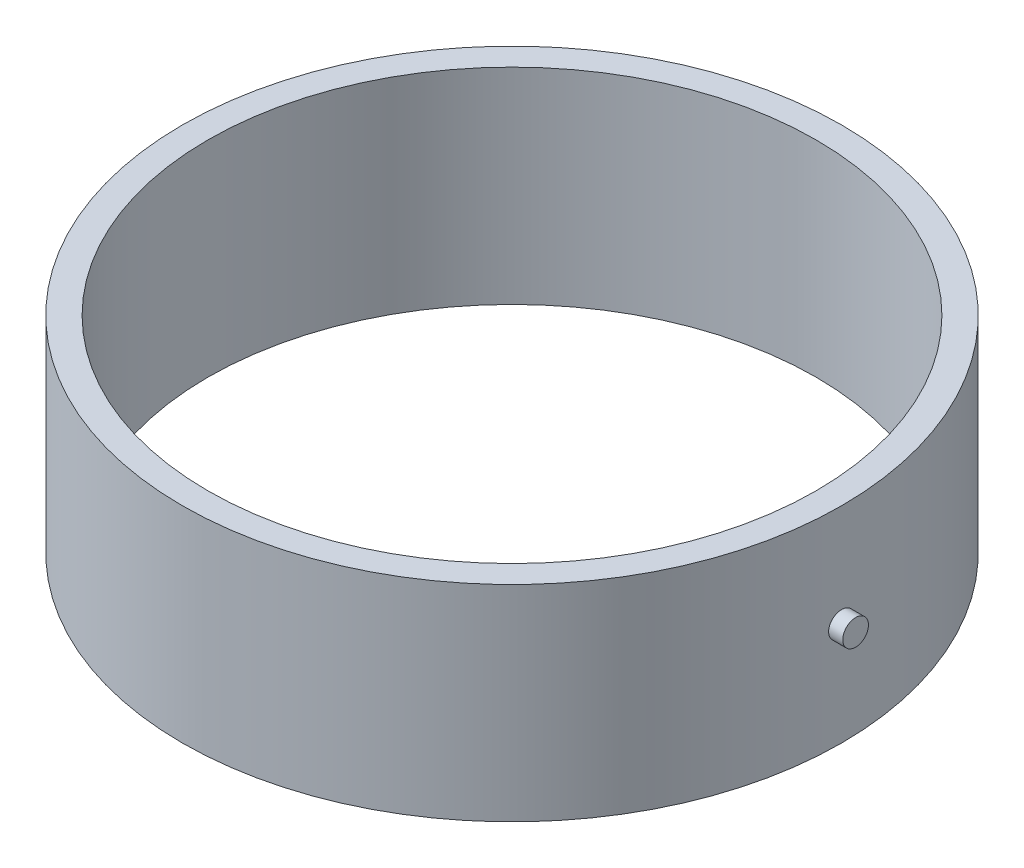
ISO-10303-21;
HEADER;
FILE_DESCRIPTION(('STEP AP214'),'2;1');
FILE_NAME('part.step','',(''),(''),'','','');
FILE_SCHEMA(('AUTOMOTIVE_DESIGN { 1 0 10303 214 1 1 1 1 }'));
ENDSEC;
DATA;
#1=APPLICATION_CONTEXT('core data for automotive mechanical design processes');
#2=APPLICATION_PROTOCOL_DEFINITION('international standard','automotive_design',2000,#1);
#3=PRODUCT_CONTEXT('',#1,'mechanical');
#4=PRODUCT('Part','Part','',(#3));
#5=PRODUCT_RELATED_PRODUCT_CATEGORY('part','',(#4));
#6=PRODUCT_DEFINITION_FORMATION('','',#4);
#7=PRODUCT_DEFINITION_CONTEXT('part definition',#1,'design');
#8=PRODUCT_DEFINITION('design','',#6,#7);
#9=PRODUCT_DEFINITION_SHAPE('','',#8);
#10=(LENGTH_UNIT() NAMED_UNIT(*) SI_UNIT(.MILLI.,.METRE.));
#11=(NAMED_UNIT(*) PLANE_ANGLE_UNIT() SI_UNIT($,.RADIAN.));
#12=(NAMED_UNIT(*) SI_UNIT($,.STERADIAN.) SOLID_ANGLE_UNIT());
#13=UNCERTAINTY_MEASURE_WITH_UNIT(LENGTH_MEASURE(1.E-05),#10,'distance_accuracy_value','');
#14=(GEOMETRIC_REPRESENTATION_CONTEXT(3) GLOBAL_UNCERTAINTY_ASSIGNED_CONTEXT((#13)) GLOBAL_UNIT_ASSIGNED_CONTEXT((#10,
#11,#12)) REPRESENTATION_CONTEXT('',''));
#15=CARTESIAN_POINT('',(0.,0.,0.));
#16=DIRECTION('',(0.,0.,1.));
#17=DIRECTION('',(1.,0.,0.));
#18=AXIS2_PLACEMENT_3D('',#15,#16,#17);
#19=CARTESIAN_POINT('',(0.,609.6,0.));
#20=DIRECTION('',(0.,-1.,0.));
#21=DIRECTION('',(0.,0.,-1.));
#22=AXIS2_PLACEMENT_3D('',#19,#20,#21);
#23=CYLINDRICAL_SURFACE('',#22,1955.8);
#24=CARTESIAN_POINT('',(-1954.31502066581,0.,76.2));
#25=CARTESIAN_POINT('',(-1954.31502054432,-1.0699032694373,76.2000012320065));
#26=CARTESIAN_POINT('',(-1954.31589970974,-2.13977115448662,76.1774645107551));
#27=CARTESIAN_POINT('',(-1954.31940995016,-4.27769876096838,76.0873576901653));
#28=CARTESIAN_POINT('',(-1954.3220411459,-5.34575835270913,76.0197844874354));
#29=CARTESIAN_POINT('',(-1954.32903762328,-7.47826453966097,75.8397046362414));
#30=CARTESIAN_POINT('',(-1954.33340321512,-8.54271045419157,75.7271899498636));
#31=CARTESIAN_POINT('',(-1954.34383786565,-10.6660100346889,75.4574159370714));
#32=CARTESIAN_POINT('',(-1954.34990708198,-11.7248631739323,75.3001524701712));
#33=CARTESIAN_POINT('',(-1954.36371255116,-13.8360504787401,74.9409860185726));
#34=CARTESIAN_POINT('',(-1954.3714504661,-14.888377060671,74.7390385218219));
#35=CARTESIAN_POINT('',(-1954.38853539624,-16.9836652100604,74.2909347100842));
#36=CARTESIAN_POINT('',(-1954.39788256222,-18.0266258903724,74.044774252631));
#37=CARTESIAN_POINT('',(-1954.4181172593,-20.1010603850933,73.5087399017551));
#38=CARTESIAN_POINT('',(-1954.42900454498,-21.1325360015167,73.2188729727253));
#39=CARTESIAN_POINT('',(-1954.45224412721,-23.1824301059313,72.5958854672413));
#40=CARTESIAN_POINT('',(-1954.46459656076,-24.2008473629953,72.2627608456219));
#41=CARTESIAN_POINT('',(-1954.49067023253,-26.2221413559985,71.554074778774));
#42=CARTESIAN_POINT('',(-1954.50439069045,-27.2250265782924,71.1785375091333));
#43=CARTESIAN_POINT('',(-1954.53310997513,-29.2141584777919,70.3855059136794));
#44=CARTESIAN_POINT('',(-1954.54810892134,-30.2004035900825,69.9680076670604));
#45=CARTESIAN_POINT('',(-1954.5792762048,-32.154332741523,69.0918602209303));
#46=CARTESIAN_POINT('',(-1954.5954444507,-33.1220182231673,68.6332142353701));
#47=CARTESIAN_POINT('',(-1954.62883782414,-35.0372740796784,67.675519427572));
#48=CARTESIAN_POINT('',(-1954.64606305033,-35.9848425655331,67.176466832096));
#49=CARTESIAN_POINT('',(-1954.68144103616,-37.8577887843304,66.1390453769815));
#50=CARTESIAN_POINT('',(-1954.69959347702,-38.7831739850955,65.6006900023939));
#51=CARTESIAN_POINT('',(-1954.73670211095,-40.6104609022474,64.4854765929411));
#52=CARTESIAN_POINT('',(-1954.75565837893,-41.512360417266,63.9086149667241));
#53=CARTESIAN_POINT('',(-1954.81352905433,-44.180220942541,62.1218729120242));
#54=CARTESIAN_POINT('',(-1954.8534550982,-45.9088550639474,60.8555521149227));
#55=CARTESIAN_POINT('',(-1954.93487519688,-49.2540984169572,58.1813005329998));
#56=CARTESIAN_POINT('',(-1954.97637014879,-50.8706420101007,56.7732879389729));
#57=CARTESIAN_POINT('',(-1955.05973486447,-53.9794533986344,53.8260678131164));
#58=CARTESIAN_POINT('',(-1955.10160462873,-55.4717210323285,52.2868601105935));
#59=CARTESIAN_POINT('',(-1955.18453135335,-58.3213598370288,49.0881602163539));
#60=CARTESIAN_POINT('',(-1955.22558828126,-59.678725633444,47.428663236773));
#61=CARTESIAN_POINT('',(-1955.30572346837,-62.2488765502836,44.0011996403346));
#62=CARTESIAN_POINT('',(-1955.34480172779,-63.46166168664,42.2332330354298));
#63=CARTESIAN_POINT('',(-1955.41988230111,-65.7343670766078,38.6008325077283));
#64=CARTESIAN_POINT('',(-1955.45588368686,-66.7942412701175,36.736369747026));
#65=CARTESIAN_POINT('',(-1955.52377546286,-68.7531463213757,32.9247077433595));
#66=CARTESIAN_POINT('',(-1955.55566585189,-69.6521771312604,30.9775084757747));
#67=CARTESIAN_POINT('',(-1955.61443005306,-71.2829820645064,27.0142228526142));
#68=CARTESIAN_POINT('',(-1955.64130388829,-72.014756957863,24.9981368142213));
#69=CARTESIAN_POINT('',(-1955.68927196711,-73.3058321590293,20.9114088023428));
#70=CARTESIAN_POINT('',(-1955.71036621381,-73.8651325598015,18.840766858263));
#71=CARTESIAN_POINT('',(-1955.74616675994,-74.8070213317288,14.6607354730608));
#72=CARTESIAN_POINT('',(-1955.76087632638,-75.1897000858249,12.5513664257603));
#73=CARTESIAN_POINT('',(-1955.78350573602,-75.7760339198753,8.30785590202983));
#74=CARTESIAN_POINT('',(-1955.7914255813,-75.9796890547327,6.17371443319731));
#75=CARTESIAN_POINT('',(-1955.80025070605,-76.2065192572113,1.89585802348664));
#76=CARTESIAN_POINT('',(-1955.80115602103,-76.2296952382835,-0.247856868883022));
#77=CARTESIAN_POINT('',(-1955.79592647495,-76.0954037803411,-4.52961201811098));
#78=CARTESIAN_POINT('',(-1955.78979161593,-75.9379363933528,-6.66765227660341));
#79=CARTESIAN_POINT('',(-1955.77066110102,-75.4436188218371,-10.921683753478));
#80=CARTESIAN_POINT('',(-1955.75766917677,-75.1068662039807,-13.0376863267659));
#81=CARTESIAN_POINT('',(-1955.72519517142,-74.2564428430637,-17.233783913662));
#82=CARTESIAN_POINT('',(-1955.70571309303,-73.742772174244,-19.313878942338));
#83=CARTESIAN_POINT('',(-1955.66081098927,-72.542174793995,-23.4233915659623));
#84=CARTESIAN_POINT('',(-1955.63539094976,-71.8552476705244,-25.4528090403759));
#85=CARTESIAN_POINT('',(-1955.57933336262,-70.3130317661298,-29.4465563659876));
#86=CARTESIAN_POINT('',(-1955.54869581283,-69.457742915858,-31.410886190376));
#87=CARTESIAN_POINT('',(-1955.48306227159,-67.5846328103103,-35.2610513521314));
#88=CARTESIAN_POINT('',(-1955.44806508816,-66.5667670828715,-37.1468650333096));
#89=CARTESIAN_POINT('',(-1955.37471080097,-64.3759089748255,-40.8260506929157));
#90=CARTESIAN_POINT('',(-1955.33635369681,-63.2029165756867,-42.6194226603001));
#91=CARTESIAN_POINT('',(-1955.25736640094,-60.7101322074961,-46.101016592764));
#92=CARTESIAN_POINT('',(-1955.21673620141,-59.3903397337004,-47.7892381962729));
#93=CARTESIAN_POINT('',(-1955.13435415897,-56.6133234952139,-51.0485588121218));
#94=CARTESIAN_POINT('',(-1955.09260231553,-55.1560996662264,-52.6196577696658));
#95=CARTESIAN_POINT('',(-1955.00913240691,-52.1135413303658,-55.6345990634161));
#96=CARTESIAN_POINT('',(-1954.96741438268,-50.528122231374,-57.0783560351707));
#97=CARTESIAN_POINT('',(-1954.88522401448,-47.2412696108866,-59.82718711311));
#98=CARTESIAN_POINT('',(-1954.8447516711,-45.5398360343915,-61.1322611535478));
#99=CARTESIAN_POINT('',(-1954.76620171989,-42.0330300532422,-63.5944526057643));
#100=CARTESIAN_POINT('',(-1954.72812411322,-40.2276575976851,-64.7515699450821));
#101=CARTESIAN_POINT('',(-1954.65544520409,-36.5257921495716,-66.9096162560734));
#102=CARTESIAN_POINT('',(-1954.62084390091,-34.6292991757558,-67.91054525987));
#103=CARTESIAN_POINT('',(-1954.55610027013,-30.7586266087664,-69.7491044621866));
#104=CARTESIAN_POINT('',(-1954.52595802602,-28.7844455617731,-70.5867316030009));
#105=CARTESIAN_POINT('',(-1954.47099034108,-24.772461959051,-72.0926910787785));
#106=CARTESIAN_POINT('',(-1954.44616490071,-22.7346593976963,-72.7610233987714));
#107=CARTESIAN_POINT('',(-1954.40253714658,-18.609935131559,-73.9236196393174));
#108=CARTESIAN_POINT('',(-1954.38373481022,-16.5230136110146,-74.4178842126629));
#109=CARTESIAN_POINT('',(-1954.35268827495,-12.3148981126607,-75.228815875971));
#110=CARTESIAN_POINT('',(-1954.34044407236,-10.1937041540854,-75.5454830656004));
#111=CARTESIAN_POINT('',(-1954.32286815757,-5.93355148425512,-75.9988062611718));
#112=CARTESIAN_POINT('',(-1954.31753190301,-3.79460537837479,-76.1355805578553));
#113=CARTESIAN_POINT('',(-1954.3139087481,0.487212713343914,-76.2285266123024));
#114=CARTESIAN_POINT('',(-1954.31562184469,2.63008469747054,-76.1846984487931));
#115=CARTESIAN_POINT('',(-1954.32604866065,6.90450552732663,-75.916753185454));
#116=CARTESIAN_POINT('',(-1954.33476236658,9.03605439477528,-75.6926364315666));
#117=CARTESIAN_POINT('',(-1954.35894260138,13.2726716120021,-75.0657157216542));
#118=CARTESIAN_POINT('',(-1954.37440912998,15.3777399628199,-74.6629117726446));
#119=CARTESIAN_POINT('',(-1954.41164958116,19.5457875620117,-73.6816439941656));
#120=CARTESIAN_POINT('',(-1954.43342156338,21.6087795497503,-73.1032342010049));
#121=CARTESIAN_POINT('',(-1954.48265643674,25.6786907545053,-71.7748357482602));
#122=CARTESIAN_POINT('',(-1954.51011932628,27.6856099872114,-71.0248471366858));
#123=CARTESIAN_POINT('',(-1954.56995653402,31.6291393419855,-69.3586294979046));
#124=CARTESIAN_POINT('',(-1954.6023308654,33.5657492752903,-68.4424000244219));
#125=CARTESIAN_POINT('',(-1954.67107240572,37.3549213570271,-66.4502182949745));
#126=CARTESIAN_POINT('',(-1954.70743961683,39.2074834599797,-65.3742659525834));
#127=CARTESIAN_POINT('',(-1954.78315546639,42.816373103932,-63.0696788468229));
#128=CARTESIAN_POINT('',(-1954.82250565391,44.5726498166543,-61.8409645389434));
#129=CARTESIAN_POINT('',(-1954.90305427102,47.975467021318,-59.2400251735009));
#130=CARTESIAN_POINT('',(-1954.94425270119,49.6220074789464,-57.8678000710645));
#131=CARTESIAN_POINT('',(-1955.0273294646,52.7936814025179,-54.9895730639468));
#132=CARTESIAN_POINT('',(-1955.0692078003,54.3188144294018,-53.4835706755136));
#133=CARTESIAN_POINT('',(-1955.1524567758,57.2368493455637,-50.3484758213501));
#134=CARTESIAN_POINT('',(-1955.19382741545,58.6297511979976,-48.719383321323));
#135=CARTESIAN_POINT('',(-1955.27490989068,61.2741496969038,-45.3487544911348));
#136=CARTESIAN_POINT('',(-1955.31462082267,62.5255699341463,-43.6071581918977));
#137=CARTESIAN_POINT('',(-1955.39123322572,64.8772435681247,-40.0246725408177));
#138=CARTESIAN_POINT('',(-1955.42813469561,65.9774969018798,-38.1837831476068));
#139=CARTESIAN_POINT('',(-1955.49808065139,68.0190026128655,-34.4157906651572));
#140=CARTESIAN_POINT('',(-1955.53112514677,68.9602553812383,-32.4886877880189));
#141=CARTESIAN_POINT('',(-1955.59241912126,70.6770552765632,-28.5619589919838));
#142=CARTESIAN_POINT('',(-1955.62066860239,71.4526024733801,-26.5623331036645));
#143=CARTESIAN_POINT('',(-1955.67156307313,72.8322600905218,-22.5053592742518));
#144=CARTESIAN_POINT('',(-1955.6942096677,73.4364196127787,-20.448028051514));
#145=CARTESIAN_POINT('',(-1955.7332660028,74.4692849090589,-16.2897259612025));
#146=CARTESIAN_POINT('',(-1955.74967574413,74.8979907055496,-14.1887550992171));
#147=CARTESIAN_POINT('',(-1955.77579240652,75.5768842418886,-9.95812895551899));
#148=CARTESIAN_POINT('',(-1955.78549934118,75.8270723439001,-7.82847373200798));
#149=CARTESIAN_POINT('',(-1955.79793477156,76.1471426572066,-3.55563689629363));
#150=CARTESIAN_POINT('',(-1955.80066327051,76.2170249518799,-1.41245529034571));
#151=CARTESIAN_POINT('',(-1955.79906489457,76.17599779238,2.87074911662647));
#152=CARTESIAN_POINT('',(-1955.79474270427,76.0652083793638,5.01077307022236));
#153=CARTESIAN_POINT('',(-1955.7791744011,75.6638560052605,9.27386976628419));
#154=CARTESIAN_POINT('',(-1955.76792829149,75.3732931291312,11.3969425167605));
#155=CARTESIAN_POINT('',(-1955.73883106382,74.6144679764119,15.6110473852403));
#156=CARTESIAN_POINT('',(-1955.72097993482,74.1462054059033,17.702079450242));
#157=CARTESIAN_POINT('',(-1955.67917884861,73.0353224129719,21.8372410914878));
#158=CARTESIAN_POINT('',(-1955.65522889019,72.3927019560606,23.8813706584544));
#159=CARTESIAN_POINT('',(-1955.60190869867,70.9376728421058,27.9082389193096));
#160=CARTESIAN_POINT('',(-1955.57253839403,70.1252619440624,29.890976802516));
#161=CARTESIAN_POINT('',(-1955.50921026183,68.3364463689405,33.7809583890966));
#162=CARTESIAN_POINT('',(-1955.47525243374,67.3600416731581,35.6882020838606));
#163=CARTESIAN_POINT('',(-1955.40371217656,65.2501985858577,39.4136233165284));
#164=CARTESIAN_POINT('',(-1955.36612987265,64.1167656173035,41.2318039272878));
#165=CARTESIAN_POINT('',(-1955.28840626089,61.7009635857211,44.7662135975));
#166=CARTESIAN_POINT('',(-1955.24826495417,60.4185945887138,46.4824427021456));
#167=CARTESIAN_POINT('',(-1955.16653049286,57.7129949623699,49.8019669893461));
#168=CARTESIAN_POINT('',(-1955.12493654472,56.2896865356026,51.4051989532161));
#169=CARTESIAN_POINT('',(-1955.06237156751,54.0576581905139,53.7155266317457));
#170=CARTESIAN_POINT('',(-1955.04148470221,53.2973606853452,54.4699790347981));
#171=CARTESIAN_POINT('',(-1954.99979861225,51.7456648965777,55.946155550188));
#172=CARTESIAN_POINT('',(-1954.97899937957,50.9542695263506,56.6678827147759));
#173=CARTESIAN_POINT('',(-1954.93762890484,49.3414937600209,58.0775741323293));
#174=CARTESIAN_POINT('',(-1954.91705774437,48.5201030578983,58.765526586728));
#175=CARTESIAN_POINT('',(-1954.87629843484,46.8491164160661,60.1061352042408));
#176=CARTESIAN_POINT('',(-1954.85611025015,45.9995231200598,60.7587946607165));
#177=CARTESIAN_POINT('',(-1954.81625700501,44.2735031860127,62.027771060264));
#178=CARTESIAN_POINT('',(-1954.79659198548,43.3970744607426,62.6440851654713));
#179=CARTESIAN_POINT('',(-1954.75792833329,41.6190848558335,63.8391653267163));
#180=CARTESIAN_POINT('',(-1954.73892963849,40.7175263337825,64.4179348882117));
#181=CARTESIAN_POINT('',(-1954.70171623132,38.8900334801985,65.5374282995815));
#182=CARTESIAN_POINT('',(-1954.68350218956,37.9640793464553,66.0781198463853));
#183=CARTESIAN_POINT('',(-1954.64800647231,36.0902562220107,67.1199108579878));
#184=CARTESIAN_POINT('',(-1954.63072470973,35.1423892903107,67.6210140232578));
#185=CARTESIAN_POINT('',(-1954.59721218772,33.2261898928189,68.5828676413603));
#186=CARTESIAN_POINT('',(-1954.58098159659,32.257854182804,69.0436116369806));
#187=CARTESIAN_POINT('',(-1954.54969162562,30.3026791167983,69.9237934380201));
#188=CARTESIAN_POINT('',(-1954.53463213605,29.3158415054162,70.3432351148922));
#189=CARTESIAN_POINT('',(-1954.50580454122,27.3263298784361,71.139712345523));
#190=CARTESIAN_POINT('',(-1954.49203515497,26.3236727521996,71.5167900402438));
#191=CARTESIAN_POINT('',(-1954.465869955,24.3034338382651,72.2283179749008));
#192=CARTESIAN_POINT('',(-1954.45347401415,23.2858534419148,72.5627721609522));
#193=CARTESIAN_POINT('',(-1954.43014456181,21.2376636157871,73.1884419981795));
#194=CARTESIAN_POINT('',(-1954.41921078804,20.2070565592426,73.4796654054803));
#195=CARTESIAN_POINT('',(-1954.39888163629,18.1345613476783,74.0184035183988));
#196=CARTESIAN_POINT('',(-1954.38948615207,17.0926739770877,74.265921242837));
#197=CARTESIAN_POINT('',(-1954.37007890776,14.7288650858167,74.7751002577515));
#198=CARTESIAN_POINT('',(-1954.36053517944,13.4041462258531,75.0238910737182));
#199=CARTESIAN_POINT('',(-1954.34409906406,10.7436850764795,75.4508318648255));
#200=CARTESIAN_POINT('',(-1954.33720609297,9.40794528151912,75.6289974003793));
#201=CARTESIAN_POINT('',(-1954.32614566911,6.72888860871243,75.9142723017064));
#202=CARTESIAN_POINT('',(-1954.32197821531,5.38557173367861,76.0213816938524));
#203=CARTESIAN_POINT('',(-1954.31641548462,2.69481842807948,76.1642526310428));
#204=CARTESIAN_POINT('',(-1954.3150208188,1.34738115494851,76.1999984484744));
#205=CARTESIAN_POINT('',(-1954.31502066581,0.,76.2));
#206=B_SPLINE_CURVE_WITH_KNOTS('',3,(#24,#25,#26,#27,#28,#29,#30,#31,#32,#33,#34,#35,#36,#37,
#38,#39,#40,#41,#42,#43,#44,#45,#46,#47,#48,#49,#50,#51,#52,#53,#54,#55,#56,#57,#58,#59,#60,#61,
#62,#63,#64,#65,#66,#67,#68,#69,#70,#71,#72,#73,#74,#75,#76,#77,#78,#79,#80,#81,#82,#83,#84,#85,
#86,#87,#88,#89,#90,#91,#92,#93,#94,#95,#96,#97,#98,#99,#100,#101,#102,#103,#104,#105,#106,#107,
#108,#109,#110,#111,#112,#113,#114,#115,#116,#117,#118,#119,#120,#121,#122,#123,#124,#125,#126,
#127,#128,#129,#130,#131,#132,#133,#134,#135,#136,#137,#138,#139,#140,#141,#142,#143,#144,#145,
#146,#147,#148,#149,#150,#151,#152,#153,#154,#155,#156,#157,#158,#159,#160,#161,#162,#163,#164,
#165,#166,#167,#168,#169,#170,#171,#172,#173,#174,#175,#176,#177,#178,#179,#180,#181,#182,#183,
#184,#185,#186,#187,#188,#189,#190,#191,#192,#193,#194,#195,#196,#197,#198,#199,#200,#201,#202,
#203,#204,#205),.UNSPECIFIED.,.T.,.F.,(4,2,2,2,2,2,2,2,2,2,2,2,2,2,2,2,2,2,2,2,2,2,2,2,2,2,2,2,
2,2,2,2,2,2,2,2,2,2,2,2,2,2,2,2,2,2,2,2,2,2,2,2,2,2,2,2,2,2,2,2,2,2,2,2,2,2,2,2,2,2,2,2,2,2,2,2,
2,2,2,2,2,2,2,2,2,2,2,2,2,2,4),(0.,3.20941094980751,6.41904307782097,9.62924951501486,
12.8397530807334,16.0534693083284,19.2674867974083,22.4809926901164,25.6947993047317,
28.9067831795972,32.1190674596281,35.331101053943,38.5434349401435,41.7546717862893,
44.9662085535541,51.3875343941837,57.8125892501662,64.2376524656913,70.6629715580538,
77.0882899423792,83.5155397493941,89.942791469028,96.3700135989584,102.797232264661,
109.221158260502,115.645082286247,122.068973798853,128.492863461346,134.913260823708,
141.333655491849,147.754065429215,154.17447801113,160.596649884959,167.018822525993,
173.441017249121,179.863214976868,186.289685651706,192.716159373191,199.142636241992,
205.569111789067,211.995707655553,218.422304090329,224.848876423702,231.275445150509,
237.697785893305,244.120123836521,250.542449456427,256.964774824192,263.385125954586,
269.805475288496,276.225841858181,282.646211901954,289.06993920229,295.493668511224,
301.917421049951,308.341175378548,314.768382543127,321.195592385469,327.622786416617,
334.049977737928,340.47532582885,346.900673096988,353.326007329836,359.751338591437,
366.172402499799,372.593463373687,379.014534868179,385.435607632775,391.85676515204,
398.277923403652,404.69885995613,411.11979366233,417.544291641852,420.757418176181,
423.970244406359,427.184185105995,430.397825377787,433.611716241012,436.825306596594,
440.041591120946,443.257574650794,446.474071781454,449.690267127747,452.903234341045,
456.115903879093,459.327996326908,462.539866823568,466.58163595484,470.622514093543,
474.663390732457,478.705157830272),.UNSPECIFIED.);
#207=CARTESIAN_POINT('',(-1954.31502066581,0.,76.2));
#208=VERTEX_POINT('',#207);
#209=EDGE_CURVE('E65',#208,#208,#206,.T.);
#210=ORIENTED_EDGE('',*,*,#209,.T.);
#211=EDGE_LOOP('',(#210));
#212=FACE_BOUND('',#211,.T.);
#213=CARTESIAN_POINT('',(0.,609.6,0.));
#214=DIRECTION('',(0.,1.,0.));
#215=DIRECTION('',(0.,0.,1.));
#216=AXIS2_PLACEMENT_3D('',#213,#214,#215);
#217=CIRCLE('',#216,1955.8);
#218=CARTESIAN_POINT('',(0.,609.6,1955.8));
#219=VERTEX_POINT('',#218);
#220=EDGE_CURVE('E49',#219,#219,#217,.T.);
#221=ORIENTED_EDGE('',*,*,#220,.F.);
#222=EDGE_LOOP('',(#221));
#223=FACE_BOUND('',#222,.T.);
#224=CARTESIAN_POINT('',(0.,-609.6,0.));
#225=DIRECTION('',(0.,1.,0.));
#226=DIRECTION('',(0.,0.,1.));
#227=AXIS2_PLACEMENT_3D('',#224,#225,#226);
#228=CIRCLE('',#227,1955.8);
#229=CARTESIAN_POINT('',(0.,-609.6,1955.8));
#230=VERTEX_POINT('',#229);
#231=EDGE_CURVE('E54',#230,#230,#228,.T.);
#232=ORIENTED_EDGE('',*,*,#231,.T.);
#233=EDGE_LOOP('',(#232));
#234=FACE_BOUND('',#233,.T.);
#235=CARTESIAN_POINT('',(1954.31502066581,0.,-76.2));
#236=CARTESIAN_POINT('',(1954.31502054432,1.0699032694373,-76.2000012320065));
#237=CARTESIAN_POINT('',(1954.31589970974,2.13977115448662,-76.1774645107551));
#238=CARTESIAN_POINT('',(1954.31940995016,4.27769876096838,-76.0873576901653));
#239=CARTESIAN_POINT('',(1954.3220411459,5.34575835270913,-76.0197844874354));
#240=CARTESIAN_POINT('',(1954.32903762328,7.47826453966097,-75.8397046362414));
#241=CARTESIAN_POINT('',(1954.33340321512,8.54271045419157,-75.7271899498636));
#242=CARTESIAN_POINT('',(1954.34383786565,10.6660100346889,-75.4574159370714));
#243=CARTESIAN_POINT('',(1954.34990708198,11.7248631739323,-75.3001524701712));
#244=CARTESIAN_POINT('',(1954.36371255116,13.8360504787401,-74.9409860185726));
#245=CARTESIAN_POINT('',(1954.3714504661,14.888377060671,-74.7390385218219));
#246=CARTESIAN_POINT('',(1954.38853539624,16.9836652100604,-74.2909347100842));
#247=CARTESIAN_POINT('',(1954.39788256222,18.0266258903724,-74.044774252631));
#248=CARTESIAN_POINT('',(1954.4181172593,20.1010603850933,-73.5087399017551));
#249=CARTESIAN_POINT('',(1954.42900454498,21.1325360015167,-73.2188729727253));
#250=CARTESIAN_POINT('',(1954.45224412721,23.1824301059313,-72.5958854672413));
#251=CARTESIAN_POINT('',(1954.46459656076,24.2008473629953,-72.2627608456219));
#252=CARTESIAN_POINT('',(1954.49067023253,26.2221413559985,-71.554074778774));
#253=CARTESIAN_POINT('',(1954.50439069045,27.2250265782924,-71.1785375091333));
#254=CARTESIAN_POINT('',(1954.53310997513,29.2141584777919,-70.3855059136794));
#255=CARTESIAN_POINT('',(1954.54810892134,30.2004035900825,-69.9680076670604));
#256=CARTESIAN_POINT('',(1954.5792762048,32.154332741523,-69.0918602209303));
#257=CARTESIAN_POINT('',(1954.5954444507,33.1220182231673,-68.6332142353701));
#258=CARTESIAN_POINT('',(1954.62883782414,35.0372740796784,-67.675519427572));
#259=CARTESIAN_POINT('',(1954.64606305033,35.9848425655331,-67.176466832096));
#260=CARTESIAN_POINT('',(1954.68144103616,37.8577887843304,-66.1390453769815));
#261=CARTESIAN_POINT('',(1954.69959347702,38.7831739850955,-65.6006900023939));
#262=CARTESIAN_POINT('',(1954.73670211095,40.6104609022474,-64.4854765929411));
#263=CARTESIAN_POINT('',(1954.75565837893,41.512360417266,-63.9086149667241));
#264=CARTESIAN_POINT('',(1954.81352905433,44.180220942541,-62.1218729120242));
#265=CARTESIAN_POINT('',(1954.8534550982,45.9088550639474,-60.8555521149227));
#266=CARTESIAN_POINT('',(1954.93487519688,49.2540984169572,-58.1813005329998));
#267=CARTESIAN_POINT('',(1954.97637014879,50.8706420101007,-56.7732879389729));
#268=CARTESIAN_POINT('',(1955.05973486447,53.9794533986344,-53.8260678131164));
#269=CARTESIAN_POINT('',(1955.10160462873,55.4717210323285,-52.2868601105935));
#270=CARTESIAN_POINT('',(1955.18453135335,58.3213598370288,-49.0881602163539));
#271=CARTESIAN_POINT('',(1955.22558828126,59.678725633444,-47.428663236773));
#272=CARTESIAN_POINT('',(1955.30572346837,62.2488765502836,-44.0011996403346));
#273=CARTESIAN_POINT('',(1955.34480172779,63.46166168664,-42.2332330354298));
#274=CARTESIAN_POINT('',(1955.41988230111,65.7343670766078,-38.6008325077283));
#275=CARTESIAN_POINT('',(1955.45588368686,66.7942412701175,-36.736369747026));
#276=CARTESIAN_POINT('',(1955.52377546286,68.7531463213757,-32.9247077433595));
#277=CARTESIAN_POINT('',(1955.55566585189,69.6521771312604,-30.9775084757747));
#278=CARTESIAN_POINT('',(1955.61443005306,71.2829820645064,-27.0142228526142));
#279=CARTESIAN_POINT('',(1955.64130388829,72.014756957863,-24.9981368142213));
#280=CARTESIAN_POINT('',(1955.68927196711,73.3058321590293,-20.9114088023428));
#281=CARTESIAN_POINT('',(1955.71036621381,73.8651325598015,-18.840766858263));
#282=CARTESIAN_POINT('',(1955.74616675994,74.8070213317288,-14.6607354730608));
#283=CARTESIAN_POINT('',(1955.76087632638,75.1897000858249,-12.5513664257603));
#284=CARTESIAN_POINT('',(1955.78350573602,75.7760339198753,-8.30785590202983));
#285=CARTESIAN_POINT('',(1955.7914255813,75.9796890547327,-6.17371443319731));
#286=CARTESIAN_POINT('',(1955.80025070605,76.2065192572113,-1.89585802348664));
#287=CARTESIAN_POINT('',(1955.80115602103,76.2296952382835,0.247856868883022));
#288=CARTESIAN_POINT('',(1955.79592647495,76.0954037803411,4.52961201811098));
#289=CARTESIAN_POINT('',(1955.78979161593,75.9379363933528,6.66765227660341));
#290=CARTESIAN_POINT('',(1955.77066110102,75.4436188218371,10.921683753478));
#291=CARTESIAN_POINT('',(1955.75766917677,75.1068662039807,13.0376863267659));
#292=CARTESIAN_POINT('',(1955.72519517142,74.2564428430637,17.233783913662));
#293=CARTESIAN_POINT('',(1955.70571309303,73.742772174244,19.313878942338));
#294=CARTESIAN_POINT('',(1955.66081098927,72.542174793995,23.4233915659623));
#295=CARTESIAN_POINT('',(1955.63539094976,71.8552476705244,25.4528090403759));
#296=CARTESIAN_POINT('',(1955.57933336262,70.3130317661298,29.4465563659876));
#297=CARTESIAN_POINT('',(1955.54869581283,69.457742915858,31.410886190376));
#298=CARTESIAN_POINT('',(1955.48306227159,67.5846328103103,35.2610513521314));
#299=CARTESIAN_POINT('',(1955.44806508816,66.5667670828715,37.1468650333096));
#300=CARTESIAN_POINT('',(1955.37471080097,64.3759089748255,40.8260506929157));
#301=CARTESIAN_POINT('',(1955.33635369681,63.2029165756867,42.6194226603001));
#302=CARTESIAN_POINT('',(1955.25736640094,60.7101322074961,46.101016592764));
#303=CARTESIAN_POINT('',(1955.21673620141,59.3903397337004,47.7892381962729));
#304=CARTESIAN_POINT('',(1955.13435415897,56.6133234952139,51.0485588121218));
#305=CARTESIAN_POINT('',(1955.09260231553,55.1560996662264,52.6196577696658));
#306=CARTESIAN_POINT('',(1955.00913240691,52.1135413303658,55.6345990634161));
#307=CARTESIAN_POINT('',(1954.96741438268,50.528122231374,57.0783560351707));
#308=CARTESIAN_POINT('',(1954.88522401448,47.2412696108866,59.82718711311));
#309=CARTESIAN_POINT('',(1954.8447516711,45.5398360343915,61.1322611535478));
#310=CARTESIAN_POINT('',(1954.76620171989,42.0330300532422,63.5944526057643));
#311=CARTESIAN_POINT('',(1954.72812411322,40.2276575976851,64.7515699450821));
#312=CARTESIAN_POINT('',(1954.65544520409,36.5257921495716,66.9096162560734));
#313=CARTESIAN_POINT('',(1954.62084390091,34.6292991757558,67.91054525987));
#314=CARTESIAN_POINT('',(1954.55610027013,30.7586266087664,69.7491044621866));
#315=CARTESIAN_POINT('',(1954.52595802602,28.7844455617731,70.5867316030009));
#316=CARTESIAN_POINT('',(1954.47099034108,24.772461959051,72.0926910787785));
#317=CARTESIAN_POINT('',(1954.44616490071,22.7346593976963,72.7610233987714));
#318=CARTESIAN_POINT('',(1954.40253714658,18.609935131559,73.9236196393174));
#319=CARTESIAN_POINT('',(1954.38373481022,16.5230136110146,74.4178842126629));
#320=CARTESIAN_POINT('',(1954.35268827495,12.3148981126607,75.228815875971));
#321=CARTESIAN_POINT('',(1954.34044407236,10.1937041540854,75.5454830656004));
#322=CARTESIAN_POINT('',(1954.32286815757,5.93355148425512,75.9988062611718));
#323=CARTESIAN_POINT('',(1954.31753190301,3.79460537837479,76.1355805578553));
#324=CARTESIAN_POINT('',(1954.3139087481,-0.487212713343912,76.2285266123024));
#325=CARTESIAN_POINT('',(1954.31562184469,-2.63008469747053,76.1846984487931));
#326=CARTESIAN_POINT('',(1954.32604866065,-6.90450552732663,75.916753185454));
#327=CARTESIAN_POINT('',(1954.33476236658,-9.03605439477528,75.6926364315666));
#328=CARTESIAN_POINT('',(1954.35894260138,-13.2726716120021,75.0657157216542));
#329=CARTESIAN_POINT('',(1954.37440912998,-15.3777399628199,74.6629117726446));
#330=CARTESIAN_POINT('',(1954.41164958116,-19.5457875620117,73.6816439941656));
#331=CARTESIAN_POINT('',(1954.43342156338,-21.6087795497503,73.1032342010049));
#332=CARTESIAN_POINT('',(1954.48265643674,-25.6786907545053,71.7748357482602));
#333=CARTESIAN_POINT('',(1954.51011932628,-27.6856099872114,71.0248471366858));
#334=CARTESIAN_POINT('',(1954.56995653402,-31.6291393419854,69.3586294979046));
#335=CARTESIAN_POINT('',(1954.6023308654,-33.5657492752903,68.4424000244219));
#336=CARTESIAN_POINT('',(1954.67107240572,-37.3549213570271,66.4502182949745));
#337=CARTESIAN_POINT('',(1954.70743961683,-39.2074834599797,65.3742659525834));
#338=CARTESIAN_POINT('',(1954.78315546639,-42.816373103932,63.0696788468229));
#339=CARTESIAN_POINT('',(1954.82250565391,-44.5726498166543,61.8409645389434));
#340=CARTESIAN_POINT('',(1954.90305427102,-47.9754670213179,59.2400251735009));
#341=CARTESIAN_POINT('',(1954.94425270119,-49.6220074789463,57.8678000710645));
#342=CARTESIAN_POINT('',(1955.0273294646,-52.7936814025179,54.9895730639468));
#343=CARTESIAN_POINT('',(1955.0692078003,-54.3188144294017,53.4835706755136));
#344=CARTESIAN_POINT('',(1955.1524567758,-57.2368493455637,50.3484758213501));
#345=CARTESIAN_POINT('',(1955.19382741545,-58.6297511979976,48.7193833213231));
#346=CARTESIAN_POINT('',(1955.27490989068,-61.2741496969038,45.3487544911348));
#347=CARTESIAN_POINT('',(1955.31462082267,-62.5255699341463,43.6071581918977));
#348=CARTESIAN_POINT('',(1955.39123322572,-64.8772435681247,40.0246725408177));
#349=CARTESIAN_POINT('',(1955.42813469561,-65.9774969018798,38.1837831476068));
#350=CARTESIAN_POINT('',(1955.49808065139,-68.0190026128655,34.4157906651572));
#351=CARTESIAN_POINT('',(1955.53112514677,-68.9602553812383,32.4886877880189));
#352=CARTESIAN_POINT('',(1955.59241912126,-70.6770552765632,28.5619589919838));
#353=CARTESIAN_POINT('',(1955.62066860239,-71.4526024733801,26.5623331036645));
#354=CARTESIAN_POINT('',(1955.67156307313,-72.8322600905218,22.5053592742518));
#355=CARTESIAN_POINT('',(1955.6942096677,-73.4364196127787,20.448028051514));
#356=CARTESIAN_POINT('',(1955.7332660028,-74.4692849090589,16.2897259612025));
#357=CARTESIAN_POINT('',(1955.74967574413,-74.8979907055496,14.1887550992171));
#358=CARTESIAN_POINT('',(1955.77579240652,-75.5768842418886,9.95812895551902));
#359=CARTESIAN_POINT('',(1955.78549934118,-75.8270723439001,7.828473732008));
#360=CARTESIAN_POINT('',(1955.79793477156,-76.1471426572066,3.55563689629364));
#361=CARTESIAN_POINT('',(1955.80066327051,-76.21702495188,1.4124552903457));
#362=CARTESIAN_POINT('',(1955.79906489457,-76.17599779238,-2.87074911662649));
#363=CARTESIAN_POINT('',(1955.79474270427,-76.0652083793637,-5.01077307022239));
#364=CARTESIAN_POINT('',(1955.7791744011,-75.6638560052605,-9.27386976628424));
#365=CARTESIAN_POINT('',(1955.76792829149,-75.3732931291312,-11.3969425167605));
#366=CARTESIAN_POINT('',(1955.73883106382,-74.6144679764119,-15.6110473852404));
#367=CARTESIAN_POINT('',(1955.72097993482,-74.1462054059033,-17.7020794502421));
#368=CARTESIAN_POINT('',(1955.67917884861,-73.0353224129719,-21.8372410914879));
#369=CARTESIAN_POINT('',(1955.65522889019,-72.3927019560606,-23.8813706584544));
#370=CARTESIAN_POINT('',(1955.60190869867,-70.9376728421058,-27.9082389193096));
#371=CARTESIAN_POINT('',(1955.57253839403,-70.1252619440624,-29.890976802516));
#372=CARTESIAN_POINT('',(1955.50921026183,-68.3364463689405,-33.7809583890966));
#373=CARTESIAN_POINT('',(1955.47525243374,-67.3600416731581,-35.6882020838606));
#374=CARTESIAN_POINT('',(1955.40371217656,-65.2501985858577,-39.4136233165284));
#375=CARTESIAN_POINT('',(1955.36612987265,-64.1167656173035,-41.2318039272878));
#376=CARTESIAN_POINT('',(1955.28840626089,-61.7009635857211,-44.7662135975));
#377=CARTESIAN_POINT('',(1955.24826495417,-60.4185945887138,-46.4824427021456));
#378=CARTESIAN_POINT('',(1955.16653049286,-57.7129949623699,-49.8019669893461));
#379=CARTESIAN_POINT('',(1955.12493654472,-56.2896865356026,-51.4051989532161));
#380=CARTESIAN_POINT('',(1955.06237156751,-54.0576581905139,-53.7155266317457));
#381=CARTESIAN_POINT('',(1955.04148470221,-53.2973606853452,-54.469979034798));
#382=CARTESIAN_POINT('',(1954.99979861225,-51.7456648965777,-55.946155550188));
#383=CARTESIAN_POINT('',(1954.97899937957,-50.9542695263506,-56.6678827147758));
#384=CARTESIAN_POINT('',(1954.93762890484,-49.3414937600209,-58.0775741323293));
#385=CARTESIAN_POINT('',(1954.91705774437,-48.5201030578983,-58.765526586728));
#386=CARTESIAN_POINT('',(1954.87629843484,-46.8491164160661,-60.1061352042407));
#387=CARTESIAN_POINT('',(1954.85611025015,-45.9995231200598,-60.7587946607164));
#388=CARTESIAN_POINT('',(1954.81625700501,-44.2735031860127,-62.027771060264));
#389=CARTESIAN_POINT('',(1954.79659198548,-43.3970744607426,-62.6440851654713));
#390=CARTESIAN_POINT('',(1954.75792833329,-41.6190848558335,-63.8391653267163));
#391=CARTESIAN_POINT('',(1954.73892963849,-40.7175263337825,-64.4179348882117));
#392=CARTESIAN_POINT('',(1954.70171623132,-38.8900334801985,-65.5374282995816));
#393=CARTESIAN_POINT('',(1954.68350218956,-37.9640793464552,-66.0781198463853));
#394=CARTESIAN_POINT('',(1954.64800647231,-36.0902562220106,-67.1199108579878));
#395=CARTESIAN_POINT('',(1954.63072470973,-35.1423892903107,-67.6210140232579));
#396=CARTESIAN_POINT('',(1954.59721218772,-33.2261898928188,-68.5828676413604));
#397=CARTESIAN_POINT('',(1954.58098159659,-32.2578541828039,-69.0436116369806));
#398=CARTESIAN_POINT('',(1954.54969162562,-30.3026791167982,-69.9237934380201));
#399=CARTESIAN_POINT('',(1954.53463213605,-29.3158415054161,-70.3432351148922));
#400=CARTESIAN_POINT('',(1954.50580454122,-27.326329878436,-71.139712345523));
#401=CARTESIAN_POINT('',(1954.49203515497,-26.3236727521995,-71.5167900402438));
#402=CARTESIAN_POINT('',(1954.465869955,-24.3034338382651,-72.2283179749008));
#403=CARTESIAN_POINT('',(1954.45347401415,-23.2858534419148,-72.5627721609522));
#404=CARTESIAN_POINT('',(1954.43014456181,-21.2376636157871,-73.1884419981796));
#405=CARTESIAN_POINT('',(1954.41921078804,-20.2070565592425,-73.4796654054803));
#406=CARTESIAN_POINT('',(1954.39888163629,-18.1345613476783,-74.0184035183988));
#407=CARTESIAN_POINT('',(1954.38948615207,-17.0926739770877,-74.265921242837));
#408=CARTESIAN_POINT('',(1954.37007890776,-14.7288650858166,-74.7751002577515));
#409=CARTESIAN_POINT('',(1954.36053517944,-13.4041462258531,-75.0238910737182));
#410=CARTESIAN_POINT('',(1954.34409906406,-10.7436850764795,-75.4508318648255));
#411=CARTESIAN_POINT('',(1954.33720609297,-9.4079452815191,-75.6289974003793));
#412=CARTESIAN_POINT('',(1954.32614566911,-6.72888860871242,-75.9142723017064));
#413=CARTESIAN_POINT('',(1954.32197821531,-5.38557173367861,-76.0213816938524));
#414=CARTESIAN_POINT('',(1954.31641548462,-2.69481842807947,-76.1642526310428));
#415=CARTESIAN_POINT('',(1954.3150208188,-1.3473811549485,-76.1999984484744));
#416=CARTESIAN_POINT('',(1954.31502066581,0.,-76.2));
#417=B_SPLINE_CURVE_WITH_KNOTS('',3,(#235,#236,#237,#238,#239,#240,#241,#242,#243,#244,#245,
#246,#247,#248,#249,#250,#251,#252,#253,#254,#255,#256,#257,#258,#259,#260,#261,#262,#263,#264,
#265,#266,#267,#268,#269,#270,#271,#272,#273,#274,#275,#276,#277,#278,#279,#280,#281,#282,#283,
#284,#285,#286,#287,#288,#289,#290,#291,#292,#293,#294,#295,#296,#297,#298,#299,#300,#301,#302,
#303,#304,#305,#306,#307,#308,#309,#310,#311,#312,#313,#314,#315,#316,#317,#318,#319,#320,#321,
#322,#323,#324,#325,#326,#327,#328,#329,#330,#331,#332,#333,#334,#335,#336,#337,#338,#339,#340,
#341,#342,#343,#344,#345,#346,#347,#348,#349,#350,#351,#352,#353,#354,#355,#356,#357,#358,#359,
#360,#361,#362,#363,#364,#365,#366,#367,#368,#369,#370,#371,#372,#373,#374,#375,#376,#377,#378,
#379,#380,#381,#382,#383,#384,#385,#386,#387,#388,#389,#390,#391,#392,#393,#394,#395,#396,#397,
#398,#399,#400,#401,#402,#403,#404,#405,#406,#407,#408,#409,#410,#411,#412,#413,#414,#415,#416),
.UNSPECIFIED.,.T.,.F.,(4,2,2,2,2,2,2,2,2,2,2,2,2,2,2,2,2,2,2,2,2,2,2,2,2,2,2,2,2,2,2,2,2,2,2,2,
2,2,2,2,2,2,2,2,2,2,2,2,2,2,2,2,2,2,2,2,2,2,2,2,2,2,2,2,2,2,2,2,2,2,2,2,2,2,2,2,2,2,2,2,2,2,2,2,
2,2,2,2,2,2,4),(0.,3.20941094980751,6.41904307782097,9.62924951501487,12.8397530807334,
16.0534693083284,19.2674867974083,22.4809926901164,25.6947993047317,28.9067831795972,
32.1190674596281,35.331101053943,38.5434349401435,41.7546717862893,44.9662085535541,
51.3875343941837,57.8125892501662,64.2376524656913,70.6629715580538,77.0882899423792,
83.5155397493941,89.942791469028,96.3700135989584,102.797232264661,109.221158260502,
115.645082286247,122.068973798853,128.492863461346,134.913260823708,141.333655491849,
147.754065429215,154.17447801113,160.596649884959,167.018822525993,173.441017249121,
179.863214976868,186.289685651706,192.716159373191,199.142636241992,205.569111789067,
211.995707655553,218.422304090329,224.848876423702,231.275445150509,237.697785893305,
244.120123836521,250.542449456427,256.964774824192,263.385125954586,269.805475288496,
276.22584185818,282.646211901954,289.06993920229,295.493668511224,301.917421049951,
308.341175378548,314.768382543127,321.195592385469,327.622786416617,334.049977737928,
340.47532582885,346.900673096988,353.326007329836,359.751338591437,366.1724024998,
372.593463373688,379.014534868179,385.435607632776,391.85676515204,398.277923403652,
404.69885995613,411.11979366233,417.544291641852,420.757418176181,423.970244406359,
427.184185105996,430.397825377787,433.611716241012,436.825306596594,440.041591120946,
443.257574650794,446.474071781454,449.690267127747,452.903234341045,456.115903879093,
459.327996326908,462.539866823568,466.58163595484,470.622514093543,474.663390732457,
478.705157830272),.UNSPECIFIED.);
#418=CARTESIAN_POINT('',(1954.31502066581,0.,-76.2));
#419=VERTEX_POINT('',#418);
#420=EDGE_CURVE('E10',#419,#419,#417,.T.);
#421=ORIENTED_EDGE('',*,*,#420,.F.);
#422=EDGE_LOOP('',(#421));
#423=FACE_BOUND('',#422,.T.);
#424=ADVANCED_FACE('F37',(#212,#223,#234,#423),#23,.T.);
#425=CARTESIAN_POINT('',(0.,609.6,0.));
#426=DIRECTION('',(0.,1.,0.));
#427=DIRECTION('',(0.,0.,1.));
#428=AXIS2_PLACEMENT_3D('',#425,#426,#427);
#429=PLANE('',#428);
#430=ORIENTED_EDGE('',*,*,#220,.T.);
#431=EDGE_LOOP('',(#430));
#432=FACE_BOUND('',#431,.T.);
#433=CARTESIAN_POINT('',(0.,609.6,0.));
#434=DIRECTION('',(0.,1.,0.));
#435=DIRECTION('',(0.,0.,1.));
#436=AXIS2_PLACEMENT_3D('',#433,#434,#435);
#437=CIRCLE('',#436,1803.4);
#438=CARTESIAN_POINT('',(0.,609.6,-1803.4));
#439=VERTEX_POINT('',#438);
#440=EDGE_CURVE('E60',#439,#439,#437,.T.);
#441=ORIENTED_EDGE('',*,*,#440,.F.);
#442=EDGE_LOOP('',(#441));
#443=FACE_BOUND('',#442,.T.);
#444=ADVANCED_FACE('F85',(#432,#443),#429,.T.);
#445=CARTESIAN_POINT('',(0.,-609.6,0.));
#446=DIRECTION('',(0.,1.,0.));
#447=DIRECTION('',(0.,0.,1.));
#448=AXIS2_PLACEMENT_3D('',#445,#446,#447);
#449=PLANE('',#448);
#450=ORIENTED_EDGE('',*,*,#231,.F.);
#451=EDGE_LOOP('',(#450));
#452=FACE_BOUND('',#451,.T.);
#453=CARTESIAN_POINT('',(0.,-609.6,0.));
#454=DIRECTION('',(0.,1.,0.));
#455=DIRECTION('',(0.,0.,1.));
#456=AXIS2_PLACEMENT_3D('',#453,#454,#455);
#457=CIRCLE('',#456,1803.4);
#458=CARTESIAN_POINT('',(0.,-609.6,-1803.4));
#459=VERTEX_POINT('',#458);
#460=EDGE_CURVE('E63',#459,#459,#457,.T.);
#461=ORIENTED_EDGE('',*,*,#460,.T.);
#462=EDGE_LOOP('',(#461));
#463=FACE_BOUND('',#462,.T.);
#464=ADVANCED_FACE('F83',(#452,#463),#449,.F.);
#465=CARTESIAN_POINT('',(0.,609.6,0.));
#466=DIRECTION('',(0.,-1.,0.));
#467=DIRECTION('',(0.,0.,-1.));
#468=AXIS2_PLACEMENT_3D('',#465,#466,#467);
#469=CYLINDRICAL_SURFACE('',#468,1803.4);
#470=CARTESIAN_POINT('',(0.,609.6,-1803.4));
#471=CARTESIAN_POINT('',(0.,596.9,-1803.4));
#472=CARTESIAN_POINT('',(0.,584.2,-1803.4));
#473=CARTESIAN_POINT('',(0.,558.8,-1803.4));
#474=CARTESIAN_POINT('',(0.,546.1,-1803.4));
#475=CARTESIAN_POINT('',(0.,520.7,-1803.4));
#476=CARTESIAN_POINT('',(0.,508.,-1803.4));
#477=CARTESIAN_POINT('',(0.,482.6,-1803.4));
#478=CARTESIAN_POINT('',(0.,469.9,-1803.4));
#479=CARTESIAN_POINT('',(0.,444.5,-1803.4));
#480=CARTESIAN_POINT('',(0.,431.8,-1803.4));
#481=CARTESIAN_POINT('',(0.,406.4,-1803.4));
#482=CARTESIAN_POINT('',(0.,393.7,-1803.4));
#483=CARTESIAN_POINT('',(0.,368.3,-1803.4));
#484=CARTESIAN_POINT('',(0.,355.6,-1803.4));
#485=CARTESIAN_POINT('',(0.,330.2,-1803.4));
#486=CARTESIAN_POINT('',(0.,317.5,-1803.4));
#487=CARTESIAN_POINT('',(0.,292.1,-1803.4));
#488=CARTESIAN_POINT('',(0.,279.4,-1803.4));
#489=CARTESIAN_POINT('',(0.,254.,-1803.4));
#490=CARTESIAN_POINT('',(0.,241.3,-1803.4));
#491=CARTESIAN_POINT('',(0.,215.9,-1803.4));
#492=CARTESIAN_POINT('',(0.,203.2,-1803.4));
#493=CARTESIAN_POINT('',(0.,177.8,-1803.4));
#494=CARTESIAN_POINT('',(0.,165.1,-1803.4));
#495=CARTESIAN_POINT('',(0.,139.7,-1803.4));
#496=CARTESIAN_POINT('',(0.,127.,-1803.4));
#497=CARTESIAN_POINT('',(0.,101.6,-1803.4));
#498=CARTESIAN_POINT('',(0.,88.9,-1803.4));
#499=CARTESIAN_POINT('',(0.,63.5,-1803.4));
#500=CARTESIAN_POINT('',(0.,50.8,-1803.4));
#501=CARTESIAN_POINT('',(0.,25.4,-1803.4));
#502=CARTESIAN_POINT('',(0.,12.7,-1803.4));
#503=CARTESIAN_POINT('',(0.,-12.7,-1803.4));
#504=CARTESIAN_POINT('',(0.,-25.4,-1803.4));
#505=CARTESIAN_POINT('',(0.,-50.8,-1803.4));
#506=CARTESIAN_POINT('',(0.,-63.5,-1803.4));
#507=CARTESIAN_POINT('',(0.,-88.9,-1803.4));
#508=CARTESIAN_POINT('',(0.,-101.6,-1803.4));
#509=CARTESIAN_POINT('',(0.,-127.,-1803.4));
#510=CARTESIAN_POINT('',(0.,-139.7,-1803.4));
#511=CARTESIAN_POINT('',(0.,-165.1,-1803.4));
#512=CARTESIAN_POINT('',(0.,-177.8,-1803.4));
#513=CARTESIAN_POINT('',(0.,-203.2,-1803.4));
#514=CARTESIAN_POINT('',(0.,-215.9,-1803.4));
#515=CARTESIAN_POINT('',(0.,-241.3,-1803.4));
#516=CARTESIAN_POINT('',(0.,-254.,-1803.4));
#517=CARTESIAN_POINT('',(0.,-279.4,-1803.4));
#518=CARTESIAN_POINT('',(0.,-292.1,-1803.4));
#519=CARTESIAN_POINT('',(0.,-317.5,-1803.4));
#520=CARTESIAN_POINT('',(0.,-330.2,-1803.4));
#521=CARTESIAN_POINT('',(0.,-355.6,-1803.4));
#522=CARTESIAN_POINT('',(0.,-368.3,-1803.4));
#523=CARTESIAN_POINT('',(0.,-393.7,-1803.4));
#524=CARTESIAN_POINT('',(0.,-406.4,-1803.4));
#525=CARTESIAN_POINT('',(0.,-431.8,-1803.4));
#526=CARTESIAN_POINT('',(0.,-444.5,-1803.4));
#527=CARTESIAN_POINT('',(0.,-469.9,-1803.4));
#528=CARTESIAN_POINT('',(0.,-482.6,-1803.4));
#529=CARTESIAN_POINT('',(0.,-508.,-1803.4));
#530=CARTESIAN_POINT('',(0.,-520.7,-1803.4));
#531=CARTESIAN_POINT('',(0.,-546.1,-1803.4));
#532=CARTESIAN_POINT('',(0.,-558.8,-1803.4));
#533=CARTESIAN_POINT('',(0.,-584.2,-1803.4));
#534=CARTESIAN_POINT('',(0.,-596.9,-1803.4));
#535=CARTESIAN_POINT('',(0.,-609.6,-1803.4));
#536=B_SPLINE_CURVE_WITH_KNOTS('',3,(#470,#471,#472,#473,#474,#475,#476,#477,#478,#479,#480,
#481,#482,#483,#484,#485,#486,#487,#488,#489,#490,#491,#492,#493,#494,#495,#496,#497,#498,#499,
#500,#501,#502,#503,#504,#505,#506,#507,#508,#509,#510,#511,#512,#513,#514,#515,#516,#517,#518,
#519,#520,#521,#522,#523,#524,#525,#526,#527,#528,#529,#530,#531,#532,#533,#534,#535),
.UNSPECIFIED.,.F.,.F.,(4,2,2,2,2,2,2,2,2,2,2,2,2,2,2,2,2,2,2,2,2,2,2,2,2,2,2,2,2,2,2,2,4),(0.,
38.1,76.2,114.3,152.4,190.5,228.6,266.7,304.8,342.9,381.,419.1,457.2,495.3,533.4,571.5,609.6,
647.7,685.8,723.9,762.,800.1,838.2,876.3,914.4,952.5,990.6,1028.7,1066.8,1104.9,1143.,1181.1,
1219.2),.UNSPECIFIED.);
#537=EDGE_CURVE('BSEAM79',#439,#459,#536,.T.);
#538=ORIENTED_EDGE('',*,*,#440,.T.);
#539=ORIENTED_EDGE('',*,*,#460,.F.);
#540=ORIENTED_EDGE('',*,*,#537,.T.);
#541=ORIENTED_EDGE('',*,*,#537,.F.);
#542=EDGE_LOOP('',(#538,#540,#539,#541));
#543=FACE_BOUND('',#542,.T.);
#544=ADVANCED_FACE('F79',(#543),#469,.F.);
#545=CARTESIAN_POINT('',(-1879.6,0.,0.));
#546=DIRECTION('',(-1.,0.,0.));
#547=DIRECTION('',(0.,0.,1.));
#548=AXIS2_PLACEMENT_3D('',#545,#546,#547);
#549=CYLINDRICAL_SURFACE('',#548,76.2);
#550=CARTESIAN_POINT('',(-2038.35,0.,0.));
#551=DIRECTION('',(-1.,0.,0.));
#552=DIRECTION('',(0.,0.,1.));
#553=AXIS2_PLACEMENT_3D('',#550,#551,#552);
#554=CIRCLE('',#553,76.2);
#555=CARTESIAN_POINT('',(-2038.35,0.,76.2));
#556=VERTEX_POINT('',#555);
#557=EDGE_CURVE('E72',#556,#556,#554,.T.);
#558=ORIENTED_EDGE('',*,*,#557,.F.);
#559=EDGE_LOOP('',(#558));
#560=FACE_BOUND('',#559,.T.);
#561=ORIENTED_EDGE('',*,*,#209,.F.);
#562=EDGE_LOOP('',(#561));
#563=FACE_BOUND('',#562,.T.);
#564=ADVANCED_FACE('F73',(#560,#563),#549,.T.);
#565=CARTESIAN_POINT('',(-2038.35,0.,0.));
#566=DIRECTION('',(-1.,0.,0.));
#567=DIRECTION('',(0.,0.,1.));
#568=AXIS2_PLACEMENT_3D('',#565,#566,#567);
#569=PLANE('',#568);
#570=ORIENTED_EDGE('',*,*,#557,.T.);
#571=EDGE_LOOP('',(#570));
#572=FACE_BOUND('',#571,.T.);
#573=ADVANCED_FACE('F78',(#572),#569,.T.);
#574=CARTESIAN_POINT('',(1879.6,0.,0.));
#575=DIRECTION('',(1.,0.,0.));
#576=DIRECTION('',(0.,0.,-1.));
#577=AXIS2_PLACEMENT_3D('',#574,#575,#576);
#578=CYLINDRICAL_SURFACE('',#577,76.2);
#579=CARTESIAN_POINT('',(2038.35,0.,0.));
#580=DIRECTION('',(-1.,0.,0.));
#581=DIRECTION('',(0.,0.,1.));
#582=AXIS2_PLACEMENT_3D('',#579,#580,#581);
#583=CIRCLE('',#582,76.2);
#584=CARTESIAN_POINT('',(2038.35,0.,76.2));
#585=VERTEX_POINT('',#584);
#586=EDGE_CURVE('E158',#585,#585,#583,.T.);
#587=ORIENTED_EDGE('',*,*,#586,.T.);
#588=EDGE_LOOP('',(#587));
#589=FACE_BOUND('',#588,.T.);
#590=ORIENTED_EDGE('',*,*,#420,.T.);
#591=EDGE_LOOP('',(#590));
#592=FACE_BOUND('',#591,.T.);
#593=ADVANCED_FACE('F131',(#589,#592),#578,.T.);
#594=CARTESIAN_POINT('',(2038.35,0.,0.));
#595=DIRECTION('',(1.,0.,0.));
#596=DIRECTION('',(0.,0.,1.));
#597=AXIS2_PLACEMENT_3D('',#594,#595,#596);
#598=PLANE('',#597);
#599=ORIENTED_EDGE('',*,*,#586,.F.);
#600=EDGE_LOOP('',(#599));
#601=FACE_BOUND('',#600,.T.);
#602=ADVANCED_FACE('F139',(#601),#598,.T.);
#603=CLOSED_SHELL('',(#424,#444,#464,#544,#564,#573,#593,#602));
#604=MANIFOLD_SOLID_BREP('B2',#603);
#605=ADVANCED_BREP_SHAPE_REPRESENTATION('',(#18,#604),#14);
#606=SHAPE_DEFINITION_REPRESENTATION(#9,#605);
ENDSEC;
END-ISO-10303-21;
